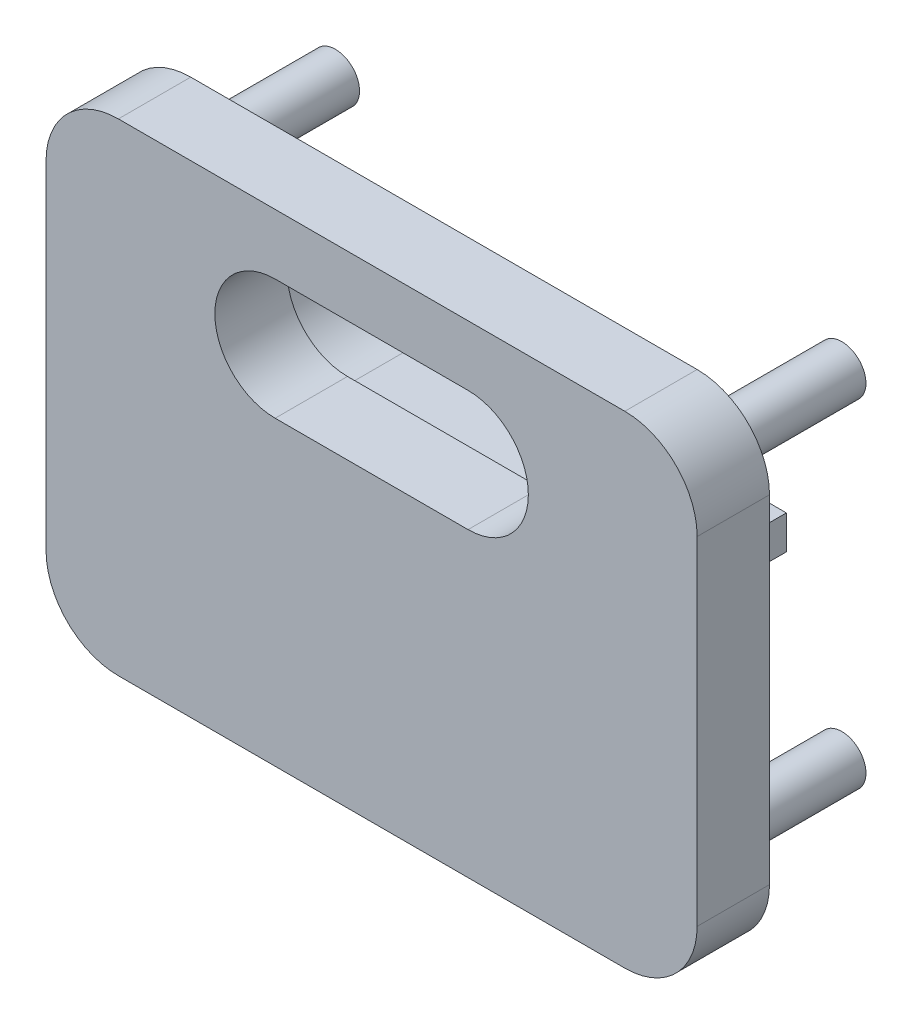
ISO-10303-21;
HEADER;
FILE_DESCRIPTION(('STEP AP214'),'2;1');
FILE_NAME('part.step','',(''),(''),'','','');
FILE_SCHEMA(('AUTOMOTIVE_DESIGN { 1 0 10303 214 1 1 1 1 }'));
ENDSEC;
DATA;
#1=APPLICATION_CONTEXT('core data for automotive mechanical design processes');
#2=APPLICATION_PROTOCOL_DEFINITION('international standard','automotive_design',2000,#1);
#3=PRODUCT_CONTEXT('',#1,'mechanical');
#4=PRODUCT('Part','Part','',(#3));
#5=PRODUCT_RELATED_PRODUCT_CATEGORY('part','',(#4));
#6=PRODUCT_DEFINITION_FORMATION('','',#4);
#7=PRODUCT_DEFINITION_CONTEXT('part definition',#1,'design');
#8=PRODUCT_DEFINITION('design','',#6,#7);
#9=PRODUCT_DEFINITION_SHAPE('','',#8);
#10=(LENGTH_UNIT() NAMED_UNIT(*) SI_UNIT(.MILLI.,.METRE.));
#11=(NAMED_UNIT(*) PLANE_ANGLE_UNIT() SI_UNIT($,.RADIAN.));
#12=(NAMED_UNIT(*) SI_UNIT($,.STERADIAN.) SOLID_ANGLE_UNIT());
#13=UNCERTAINTY_MEASURE_WITH_UNIT(LENGTH_MEASURE(1.E-05),#10,'distance_accuracy_value','');
#14=(GEOMETRIC_REPRESENTATION_CONTEXT(3) GLOBAL_UNCERTAINTY_ASSIGNED_CONTEXT((#13)) GLOBAL_UNIT_ASSIGNED_CONTEXT((#10,
#11,#12)) REPRESENTATION_CONTEXT('',''));
#15=CARTESIAN_POINT('',(0.,0.,0.));
#16=DIRECTION('',(0.,0.,1.));
#17=DIRECTION('',(1.,0.,0.));
#18=AXIS2_PLACEMENT_3D('',#15,#16,#17);
#19=CARTESIAN_POINT('',(0.,0.,-50.));
#20=DIRECTION('',(0.,-1.,0.));
#21=DIRECTION('',(0.,0.,-1.));
#22=AXIS2_PLACEMENT_3D('',#19,#20,#21);
#23=PLANE('',#22);
#24=DIRECTION('',(1.,0.,0.));
#25=VECTOR('',#24,1.);
#26=CARTESIAN_POINT('',(-0.001000000000001,0.,-3.));
#27=LINE('',#26,#25);
#28=CARTESIAN_POINT('',(3.,0.,-3.));
#29=VERTEX_POINT('',#28);
#30=CARTESIAN_POINT('',(24.,0.,-3.));
#31=VERTEX_POINT('',#30);
#32=EDGE_CURVE('E342',#29,#31,#27,.T.);
#33=ORIENTED_EDGE('',*,*,#32,.T.);
#34=DIRECTION('',(0.,0.,1.));
#35=VECTOR('',#34,1.);
#36=CARTESIAN_POINT('',(24.,0.,-50.));
#37=LINE('',#36,#35);
#38=CARTESIAN_POINT('',(24.,0.,0.));
#39=VERTEX_POINT('',#38);
#40=EDGE_CURVE('E376',#31,#39,#37,.T.);
#41=ORIENTED_EDGE('',*,*,#40,.T.);
#42=DIRECTION('',(1.,0.,0.));
#43=VECTOR('',#42,1.);
#44=CARTESIAN_POINT('',(0.,0.,0.));
#45=LINE('',#44,#43);
#46=CARTESIAN_POINT('',(3.,0.,0.));
#47=VERTEX_POINT('',#46);
#48=EDGE_CURVE('E356',#47,#39,#45,.T.);
#49=ORIENTED_EDGE('',*,*,#48,.F.);
#50=DIRECTION('',(0.,0.,1.));
#51=VECTOR('',#50,1.);
#52=CARTESIAN_POINT('',(3.,0.,-50.));
#53=LINE('',#52,#51);
#54=EDGE_CURVE('E372',#47,#29,#53,.F.);
#55=ORIENTED_EDGE('',*,*,#54,.T.);
#56=EDGE_LOOP('',(#33,#41,#49,#55));
#57=FACE_BOUND('',#56,.T.);
#58=ADVANCED_FACE('F47',(#57),#23,.T.);
#59=CARTESIAN_POINT('',(0.,20.,-50.));
#60=DIRECTION('',(-1.,0.,0.));
#61=DIRECTION('',(0.,0.,1.));
#62=AXIS2_PLACEMENT_3D('',#59,#60,#61);
#63=PLANE('',#62);
#64=DIRECTION('',(0.,-1.,0.));
#65=VECTOR('',#64,1.);
#66=CARTESIAN_POINT('',(0.,0.,-3.));
#67=LINE('',#66,#65);
#68=CARTESIAN_POINT('',(0.,17.,-3.));
#69=VERTEX_POINT('',#68);
#70=CARTESIAN_POINT('',(0.,3.,-3.));
#71=VERTEX_POINT('',#70);
#72=EDGE_CURVE('E346',#69,#71,#67,.T.);
#73=ORIENTED_EDGE('',*,*,#72,.T.);
#74=DIRECTION('',(0.,0.,1.));
#75=VECTOR('',#74,1.);
#76=CARTESIAN_POINT('',(0.,3.,-50.));
#77=LINE('',#76,#75);
#78=CARTESIAN_POINT('',(0.,3.,0.));
#79=VERTEX_POINT('',#78);
#80=EDGE_CURVE('E409',#71,#79,#77,.T.);
#81=ORIENTED_EDGE('',*,*,#80,.T.);
#82=DIRECTION('',(0.,-1.,0.));
#83=VECTOR('',#82,1.);
#84=CARTESIAN_POINT('',(0.,20.,0.));
#85=LINE('',#84,#83);
#86=CARTESIAN_POINT('',(0.,17.,0.));
#87=VERTEX_POINT('',#86);
#88=EDGE_CURVE('E368',#87,#79,#85,.T.);
#89=ORIENTED_EDGE('',*,*,#88,.F.);
#90=DIRECTION('',(0.,0.,1.));
#91=VECTOR('',#90,1.);
#92=CARTESIAN_POINT('',(0.,17.,-50.));
#93=LINE('',#92,#91);
#94=EDGE_CURVE('E405',#87,#69,#93,.F.);
#95=ORIENTED_EDGE('',*,*,#94,.T.);
#96=EDGE_LOOP('',(#73,#81,#89,#95));
#97=FACE_BOUND('',#96,.T.);
#98=ADVANCED_FACE('F449',(#97),#63,.T.);
#99=CARTESIAN_POINT('',(0.,20.,-50.));
#100=DIRECTION('',(0.,1.,0.));
#101=DIRECTION('',(0.,0.,1.));
#102=AXIS2_PLACEMENT_3D('',#99,#100,#101);
#103=PLANE('',#102);
#104=DIRECTION('',(1.,0.,0.));
#105=VECTOR('',#104,1.);
#106=CARTESIAN_POINT('',(-0.00100000000001488,20.,-3.));
#107=LINE('',#106,#105);
#108=CARTESIAN_POINT('',(3.,20.,-3.));
#109=VERTEX_POINT('',#108);
#110=CARTESIAN_POINT('',(24.,20.,-3.));
#111=VERTEX_POINT('',#110);
#112=EDGE_CURVE('E341',#109,#111,#107,.T.);
#113=ORIENTED_EDGE('',*,*,#112,.F.);
#114=DIRECTION('',(0.,0.,1.));
#115=VECTOR('',#114,1.);
#116=CARTESIAN_POINT('',(3.,20.,-50.));
#117=LINE('',#116,#115);
#118=CARTESIAN_POINT('',(3.,20.,0.));
#119=VERTEX_POINT('',#118);
#120=EDGE_CURVE('E398',#109,#119,#117,.T.);
#121=ORIENTED_EDGE('',*,*,#120,.T.);
#122=DIRECTION('',(-1.,0.,0.));
#123=VECTOR('',#122,1.);
#124=CARTESIAN_POINT('',(0.,20.,0.));
#125=LINE('',#124,#123);
#126=CARTESIAN_POINT('',(24.,20.,0.));
#127=VERTEX_POINT('',#126);
#128=EDGE_CURVE('E364',#127,#119,#125,.T.);
#129=ORIENTED_EDGE('',*,*,#128,.F.);
#130=DIRECTION('',(0.,0.,1.));
#131=VECTOR('',#130,1.);
#132=CARTESIAN_POINT('',(24.,20.,-50.));
#133=LINE('',#132,#131);
#134=EDGE_CURVE('E401',#127,#111,#133,.F.);
#135=ORIENTED_EDGE('',*,*,#134,.T.);
#136=EDGE_LOOP('',(#113,#121,#129,#135));
#137=FACE_BOUND('',#136,.T.);
#138=ADVANCED_FACE('F454',(#137),#103,.T.);
#139=CARTESIAN_POINT('',(27.,20.,-50.));
#140=DIRECTION('',(1.,0.,0.));
#141=DIRECTION('',(0.,1.,0.));
#142=AXIS2_PLACEMENT_3D('',#139,#140,#141);
#143=PLANE('',#142);
#144=DIRECTION('',(0.,-1.,0.));
#145=VECTOR('',#144,1.);
#146=CARTESIAN_POINT('',(27.,0.,-3.));
#147=LINE('',#146,#145);
#148=CARTESIAN_POINT('',(27.,17.,-3.));
#149=VERTEX_POINT('',#148);
#150=CARTESIAN_POINT('',(27.,3.,-3.));
#151=VERTEX_POINT('',#150);
#152=EDGE_CURVE('E338',#149,#151,#147,.T.);
#153=ORIENTED_EDGE('',*,*,#152,.F.);
#154=DIRECTION('',(0.,0.,1.));
#155=VECTOR('',#154,1.);
#156=CARTESIAN_POINT('',(27.,17.,-50.));
#157=LINE('',#156,#155);
#158=CARTESIAN_POINT('',(27.,17.,0.));
#159=VERTEX_POINT('',#158);
#160=EDGE_CURVE('E391',#149,#159,#157,.T.);
#161=ORIENTED_EDGE('',*,*,#160,.T.);
#162=DIRECTION('',(0.,1.,0.));
#163=VECTOR('',#162,1.);
#164=CARTESIAN_POINT('',(27.,20.,0.));
#165=LINE('',#164,#163);
#166=CARTESIAN_POINT('',(27.,3.,0.));
#167=VERTEX_POINT('',#166);
#168=EDGE_CURVE('E360',#167,#159,#165,.T.);
#169=ORIENTED_EDGE('',*,*,#168,.F.);
#170=DIRECTION('',(0.,0.,1.));
#171=VECTOR('',#170,1.);
#172=CARTESIAN_POINT('',(27.,3.,-50.));
#173=LINE('',#172,#171);
#174=EDGE_CURVE('E394',#167,#151,#173,.F.);
#175=ORIENTED_EDGE('',*,*,#174,.T.);
#176=EDGE_LOOP('',(#153,#161,#169,#175));
#177=FACE_BOUND('',#176,.T.);
#178=ADVANCED_FACE('F463',(#177),#143,.T.);
#179=CARTESIAN_POINT('',(0.,0.,0.));
#180=DIRECTION('',(0.,0.,-1.));
#181=DIRECTION('',(-1.,0.,0.));
#182=AXIS2_PLACEMENT_3D('',#179,#180,#181);
#183=PLANE('',#182);
#184=DIRECTION('',(-1.,0.,0.));
#185=VECTOR('',#184,1.);
#186=CARTESIAN_POINT('',(17.5,17.5,0.));
#187=LINE('',#186,#185);
#188=CARTESIAN_POINT('',(17.5,17.5,0.));
#189=VERTEX_POINT('',#188);
#190=CARTESIAN_POINT('',(9.49999999999999,17.5,0.));
#191=VERTEX_POINT('',#190);
#192=EDGE_CURVE('E291',#189,#191,#187,.T.);
#193=ORIENTED_EDGE('',*,*,#192,.F.);
#194=CARTESIAN_POINT('',(17.5,15.,0.));
#195=DIRECTION('',(0.,0.,-1.));
#196=DIRECTION('',(-1.,0.,0.));
#197=AXIS2_PLACEMENT_3D('',#194,#195,#196);
#198=CIRCLE('',#197,2.5);
#199=CARTESIAN_POINT('',(17.5,12.5,0.));
#200=VERTEX_POINT('',#199);
#201=EDGE_CURVE('E295',#200,#189,#198,.F.);
#202=ORIENTED_EDGE('',*,*,#201,.F.);
#203=DIRECTION('',(1.,0.,0.));
#204=VECTOR('',#203,1.);
#205=CARTESIAN_POINT('',(17.5,12.5,0.));
#206=LINE('',#205,#204);
#207=CARTESIAN_POINT('',(9.49999999999999,12.5,0.));
#208=VERTEX_POINT('',#207);
#209=EDGE_CURVE('E310',#208,#200,#206,.T.);
#210=ORIENTED_EDGE('',*,*,#209,.F.);
#211=CARTESIAN_POINT('',(9.49999999999999,15.,0.));
#212=DIRECTION('',(0.,0.,-1.));
#213=DIRECTION('',(-1.,0.,0.));
#214=AXIS2_PLACEMENT_3D('',#211,#212,#213);
#215=CIRCLE('',#214,2.5);
#216=EDGE_CURVE('E288',#191,#208,#215,.F.);
#217=ORIENTED_EDGE('',*,*,#216,.F.);
#218=EDGE_LOOP('',(#193,#202,#210,#217));
#219=FACE_BOUND('',#218,.T.);
#220=ORIENTED_EDGE('',*,*,#48,.T.);
#221=CARTESIAN_POINT('',(24.,3.,0.));
#222=DIRECTION('',(0.,0.,-1.));
#223=DIRECTION('',(-1.,0.,0.));
#224=AXIS2_PLACEMENT_3D('',#221,#222,#223);
#225=CIRCLE('',#224,3.);
#226=EDGE_CURVE('E388',#39,#167,#225,.F.);
#227=ORIENTED_EDGE('',*,*,#226,.T.);
#228=ORIENTED_EDGE('',*,*,#168,.T.);
#229=CARTESIAN_POINT('',(24.,17.,0.));
#230=DIRECTION('',(0.,0.,-1.));
#231=DIRECTION('',(-1.,0.,0.));
#232=AXIS2_PLACEMENT_3D('',#229,#230,#231);
#233=CIRCLE('',#232,3.);
#234=EDGE_CURVE('E385',#159,#127,#233,.F.);
#235=ORIENTED_EDGE('',*,*,#234,.T.);
#236=ORIENTED_EDGE('',*,*,#128,.T.);
#237=CARTESIAN_POINT('',(3.,17.,0.));
#238=DIRECTION('',(0.,0.,-1.));
#239=DIRECTION('',(-1.,0.,0.));
#240=AXIS2_PLACEMENT_3D('',#237,#238,#239);
#241=CIRCLE('',#240,3.);
#242=EDGE_CURVE('E379',#119,#87,#241,.F.);
#243=ORIENTED_EDGE('',*,*,#242,.T.);
#244=ORIENTED_EDGE('',*,*,#88,.T.);
#245=CARTESIAN_POINT('',(3.,3.,0.));
#246=DIRECTION('',(0.,0.,-1.));
#247=DIRECTION('',(-1.,0.,0.));
#248=AXIS2_PLACEMENT_3D('',#245,#246,#247);
#249=CIRCLE('',#248,3.);
#250=EDGE_CURVE('E382',#79,#47,#249,.F.);
#251=ORIENTED_EDGE('',*,*,#250,.T.);
#252=EDGE_LOOP('',(#220,#227,#228,#235,#236,#243,#244,#251));
#253=FACE_BOUND('',#252,.T.);
#254=ADVANCED_FACE('F443',(#219,#253),#183,.F.);
#255=CARTESIAN_POINT('',(24.,3.,-50.));
#256=DIRECTION('',(0.,0.,1.));
#257=DIRECTION('',(1.,0.,0.));
#258=AXIS2_PLACEMENT_3D('',#255,#256,#257);
#259=CYLINDRICAL_SURFACE('',#258,3.);
#260=CARTESIAN_POINT('',(24.,3.,-3.));
#261=DIRECTION('',(0.,0.,1.));
#262=DIRECTION('',(0.,-1.,0.));
#263=AXIS2_PLACEMENT_3D('',#260,#261,#262);
#264=CIRCLE('',#263,3.);
#265=EDGE_CURVE('E330',#31,#151,#264,.T.);
#266=ORIENTED_EDGE('',*,*,#265,.T.);
#267=ORIENTED_EDGE('',*,*,#174,.F.);
#268=ORIENTED_EDGE('',*,*,#226,.F.);
#269=ORIENTED_EDGE('',*,*,#40,.F.);
#270=EDGE_LOOP('',(#266,#267,#268,#269));
#271=FACE_BOUND('',#270,.T.);
#272=ADVANCED_FACE('F466',(#271),#259,.T.);
#273=CARTESIAN_POINT('',(24.,17.,-50.));
#274=DIRECTION('',(0.,0.,1.));
#275=DIRECTION('',(1.,0.,0.));
#276=AXIS2_PLACEMENT_3D('',#273,#274,#275);
#277=CYLINDRICAL_SURFACE('',#276,3.);
#278=CARTESIAN_POINT('',(24.,17.,-3.));
#279=DIRECTION('',(0.,0.,1.));
#280=DIRECTION('',(0.,-1.,0.));
#281=AXIS2_PLACEMENT_3D('',#278,#279,#280);
#282=CIRCLE('',#281,3.);
#283=EDGE_CURVE('E326',#149,#111,#282,.T.);
#284=ORIENTED_EDGE('',*,*,#283,.T.);
#285=ORIENTED_EDGE('',*,*,#134,.F.);
#286=ORIENTED_EDGE('',*,*,#234,.F.);
#287=ORIENTED_EDGE('',*,*,#160,.F.);
#288=EDGE_LOOP('',(#284,#285,#286,#287));
#289=FACE_BOUND('',#288,.T.);
#290=ADVANCED_FACE('F459',(#289),#277,.T.);
#291=CARTESIAN_POINT('',(3.,3.,-50.));
#292=DIRECTION('',(0.,0.,1.));
#293=DIRECTION('',(1.,0.,0.));
#294=AXIS2_PLACEMENT_3D('',#291,#292,#293);
#295=CYLINDRICAL_SURFACE('',#294,3.);
#296=CARTESIAN_POINT('',(3.,3.,-3.));
#297=DIRECTION('',(0.,0.,1.));
#298=DIRECTION('',(0.,-1.,0.));
#299=AXIS2_PLACEMENT_3D('',#296,#297,#298);
#300=CIRCLE('',#299,3.);
#301=EDGE_CURVE('E352',#71,#29,#300,.T.);
#302=ORIENTED_EDGE('',*,*,#301,.T.);
#303=ORIENTED_EDGE('',*,*,#54,.F.);
#304=ORIENTED_EDGE('',*,*,#250,.F.);
#305=ORIENTED_EDGE('',*,*,#80,.F.);
#306=EDGE_LOOP('',(#302,#303,#304,#305));
#307=FACE_BOUND('',#306,.T.);
#308=ADVANCED_FACE('F438',(#307),#295,.T.);
#309=CARTESIAN_POINT('',(3.,17.,-50.));
#310=DIRECTION('',(0.,0.,1.));
#311=DIRECTION('',(1.,0.,0.));
#312=AXIS2_PLACEMENT_3D('',#309,#310,#311);
#313=CYLINDRICAL_SURFACE('',#312,3.);
#314=CARTESIAN_POINT('',(3.,17.,-3.));
#315=DIRECTION('',(0.,0.,1.));
#316=DIRECTION('',(0.,-1.,0.));
#317=AXIS2_PLACEMENT_3D('',#314,#315,#316);
#318=CIRCLE('',#317,3.);
#319=EDGE_CURVE('E334',#109,#69,#318,.T.);
#320=ORIENTED_EDGE('',*,*,#319,.T.);
#321=ORIENTED_EDGE('',*,*,#94,.F.);
#322=ORIENTED_EDGE('',*,*,#242,.F.);
#323=ORIENTED_EDGE('',*,*,#120,.F.);
#324=EDGE_LOOP('',(#320,#321,#322,#323));
#325=FACE_BOUND('',#324,.T.);
#326=ADVANCED_FACE('F49',(#325),#313,.T.);
#327=CARTESIAN_POINT('',(-0.001000000000001,0.,-3.));
#328=DIRECTION('',(0.,0.,1.));
#329=DIRECTION('',(0.,-1.,0.));
#330=AXIS2_PLACEMENT_3D('',#327,#328,#329);
#331=PLANE('',#330);
#332=DIRECTION('',(1.,0.,0.));
#333=VECTOR('',#332,1.);
#334=CARTESIAN_POINT('',(0.,12.5,-3.));
#335=LINE('',#334,#333);
#336=CARTESIAN_POINT('',(9.49999999999999,12.5,-3.));
#337=VERTEX_POINT('',#336);
#338=CARTESIAN_POINT('',(17.5,12.5,-3.));
#339=VERTEX_POINT('',#338);
#340=EDGE_CURVE('E257',#337,#339,#335,.T.);
#341=ORIENTED_EDGE('',*,*,#340,.T.);
#342=CARTESIAN_POINT('',(17.5,15.,-3.));
#343=DIRECTION('',(0.,0.,1.));
#344=DIRECTION('',(0.,-1.,0.));
#345=AXIS2_PLACEMENT_3D('',#342,#343,#344);
#346=CIRCLE('',#345,2.5);
#347=CARTESIAN_POINT('',(17.5,17.5,-3.));
#348=VERTEX_POINT('',#347);
#349=EDGE_CURVE('E303',#348,#339,#346,.F.);
#350=ORIENTED_EDGE('',*,*,#349,.F.);
#351=DIRECTION('',(1.,0.,0.));
#352=VECTOR('',#351,1.);
#353=CARTESIAN_POINT('',(17.5,17.5,-3.));
#354=LINE('',#353,#352);
#355=CARTESIAN_POINT('',(9.49999999999999,17.5,-3.));
#356=VERTEX_POINT('',#355);
#357=EDGE_CURVE('E299',#356,#348,#354,.T.);
#358=ORIENTED_EDGE('',*,*,#357,.F.);
#359=CARTESIAN_POINT('',(9.49999999999999,15.,-3.));
#360=DIRECTION('',(0.,0.,1.));
#361=DIRECTION('',(0.,-1.,0.));
#362=AXIS2_PLACEMENT_3D('',#359,#360,#361);
#363=CIRCLE('',#362,2.5);
#364=EDGE_CURVE('E71',#337,#356,#363,.F.);
#365=ORIENTED_EDGE('',*,*,#364,.F.);
#366=EDGE_LOOP('',(#341,#350,#358,#365));
#367=FACE_BOUND('',#366,.T.);
#368=CARTESIAN_POINT('',(24.,3.,-3.));
#369=DIRECTION('',(0.,0.,1.));
#370=DIRECTION('',(0.,-1.,0.));
#371=AXIS2_PLACEMENT_3D('',#368,#369,#370);
#372=CIRCLE('',#371,1.);
#373=CARTESIAN_POINT('',(24.,2.,-3.));
#374=VERTEX_POINT('',#373);
#375=EDGE_CURVE('E11',#374,#374,#372,.F.);
#376=ORIENTED_EDGE('',*,*,#375,.F.);
#377=EDGE_LOOP('',(#376));
#378=FACE_BOUND('',#377,.T.);
#379=CARTESIAN_POINT('',(3.,3.,-3.));
#380=DIRECTION('',(0.,0.,1.));
#381=DIRECTION('',(0.,-1.,0.));
#382=AXIS2_PLACEMENT_3D('',#379,#380,#381);
#383=CIRCLE('',#382,1.);
#384=CARTESIAN_POINT('',(3.,2.,-3.));
#385=VERTEX_POINT('',#384);
#386=EDGE_CURVE('E56',#385,#385,#383,.F.);
#387=ORIENTED_EDGE('',*,*,#386,.F.);
#388=EDGE_LOOP('',(#387));
#389=FACE_BOUND('',#388,.T.);
#390=CARTESIAN_POINT('',(3.,17.,-3.));
#391=DIRECTION('',(0.,0.,1.));
#392=DIRECTION('',(0.,-1.,0.));
#393=AXIS2_PLACEMENT_3D('',#390,#391,#392);
#394=CIRCLE('',#393,1.);
#395=CARTESIAN_POINT('',(3.,16.,-3.));
#396=VERTEX_POINT('',#395);
#397=EDGE_CURVE('E416',#396,#396,#394,.F.);
#398=ORIENTED_EDGE('',*,*,#397,.F.);
#399=EDGE_LOOP('',(#398));
#400=FACE_BOUND('',#399,.T.);
#401=CARTESIAN_POINT('',(24.,17.,-3.));
#402=DIRECTION('',(0.,0.,1.));
#403=DIRECTION('',(0.,-1.,0.));
#404=AXIS2_PLACEMENT_3D('',#401,#402,#403);
#405=CIRCLE('',#404,1.);
#406=CARTESIAN_POINT('',(24.,16.,-3.));
#407=VERTEX_POINT('',#406);
#408=EDGE_CURVE('E412',#407,#407,#405,.F.);
#409=ORIENTED_EDGE('',*,*,#408,.F.);
#410=EDGE_LOOP('',(#409));
#411=FACE_BOUND('',#410,.T.);
#412=ORIENTED_EDGE('',*,*,#32,.F.);
#413=ORIENTED_EDGE('',*,*,#301,.F.);
#414=ORIENTED_EDGE('',*,*,#72,.F.);
#415=ORIENTED_EDGE('',*,*,#319,.F.);
#416=ORIENTED_EDGE('',*,*,#112,.T.);
#417=ORIENTED_EDGE('',*,*,#283,.F.);
#418=ORIENTED_EDGE('',*,*,#152,.T.);
#419=ORIENTED_EDGE('',*,*,#265,.F.);
#420=EDGE_LOOP('',(#412,#413,#414,#415,#416,#417,#418,#419));
#421=FACE_BOUND('',#420,.T.);
#422=CARTESIAN_POINT('',(17.5,15.,-3.));
#423=DIRECTION('',(0.,0.,1.));
#424=DIRECTION('',(0.,-1.,0.));
#425=AXIS2_PLACEMENT_3D('',#422,#423,#424);
#426=CIRCLE('',#425,2.8);
#427=CARTESIAN_POINT('',(20.0298221281347,16.2,-3.));
#428=VERTEX_POINT('',#427);
#429=CARTESIAN_POINT('',(17.5,12.2,-3.));
#430=VERTEX_POINT('',#429);
#431=EDGE_CURVE('E236',#428,#430,#426,.F.);
#432=ORIENTED_EDGE('',*,*,#431,.T.);
#433=DIRECTION('',(-1.,0.,0.));
#434=VECTOR('',#433,1.);
#435=CARTESIAN_POINT('',(0.,12.2,-3.));
#436=LINE('',#435,#434);
#437=CARTESIAN_POINT('',(9.49999999999999,12.2,-3.));
#438=VERTEX_POINT('',#437);
#439=EDGE_CURVE('E721',#430,#438,#436,.T.);
#440=ORIENTED_EDGE('',*,*,#439,.T.);
#441=CARTESIAN_POINT('',(9.49999999999999,15.,-3.));
#442=DIRECTION('',(0.,0.,1.));
#443=DIRECTION('',(0.,-1.,0.));
#444=AXIS2_PLACEMENT_3D('',#441,#442,#443);
#445=CIRCLE('',#444,2.8);
#446=CARTESIAN_POINT('',(6.9701778718653,16.2,-3.));
#447=VERTEX_POINT('',#446);
#448=EDGE_CURVE('E713',#438,#447,#445,.F.);
#449=ORIENTED_EDGE('',*,*,#448,.T.);
#450=DIRECTION('',(1.,0.,0.));
#451=VECTOR('',#450,1.);
#452=CARTESIAN_POINT('',(0.,16.2,-3.));
#453=LINE('',#452,#451);
#454=CARTESIAN_POINT('',(4.3,16.2,-3.));
#455=VERTEX_POINT('',#454);
#456=EDGE_CURVE('E719',#455,#447,#453,.T.);
#457=ORIENTED_EDGE('',*,*,#456,.F.);
#458=DIRECTION('',(0.,1.,0.));
#459=VECTOR('',#458,1.);
#460=CARTESIAN_POINT('',(4.3,0.,-3.));
#461=LINE('',#460,#459);
#462=CARTESIAN_POINT('',(4.3,13.7,-3.));
#463=VERTEX_POINT('',#462);
#464=EDGE_CURVE('E726',#463,#455,#461,.T.);
#465=ORIENTED_EDGE('',*,*,#464,.F.);
#466=DIRECTION('',(1.,0.,0.));
#467=VECTOR('',#466,1.);
#468=CARTESIAN_POINT('',(0.,13.7,-3.));
#469=LINE('',#468,#467);
#470=CARTESIAN_POINT('',(2.29999999999999,13.7,-3.));
#471=VERTEX_POINT('',#470);
#472=EDGE_CURVE('E732',#471,#463,#469,.T.);
#473=ORIENTED_EDGE('',*,*,#472,.F.);
#474=DIRECTION('',(0.,1.,0.));
#475=VECTOR('',#474,1.);
#476=CARTESIAN_POINT('',(2.29999999999999,0.,-3.));
#477=LINE('',#476,#475);
#478=CARTESIAN_POINT('',(2.29999999999999,12.3,-3.));
#479=VERTEX_POINT('',#478);
#480=EDGE_CURVE('E735',#479,#471,#477,.T.);
#481=ORIENTED_EDGE('',*,*,#480,.F.);
#482=DIRECTION('',(-1.,0.,0.));
#483=VECTOR('',#482,1.);
#484=CARTESIAN_POINT('',(0.,12.3,-3.));
#485=LINE('',#484,#483);
#486=CARTESIAN_POINT('',(4.8,12.3,-3.));
#487=VERTEX_POINT('',#486);
#488=EDGE_CURVE('E738',#487,#479,#485,.T.);
#489=ORIENTED_EDGE('',*,*,#488,.F.);
#490=DIRECTION('',(0.,1.,0.));
#491=VECTOR('',#490,1.);
#492=CARTESIAN_POINT('',(4.8,0.,-3.));
#493=LINE('',#492,#491);
#494=CARTESIAN_POINT('',(4.8,3.3,-3.));
#495=VERTEX_POINT('',#494);
#496=EDGE_CURVE('E741',#495,#487,#493,.T.);
#497=ORIENTED_EDGE('',*,*,#496,.F.);
#498=DIRECTION('',(-1.,0.,0.));
#499=VECTOR('',#498,1.);
#500=CARTESIAN_POINT('',(0.,3.3,-3.));
#501=LINE('',#500,#499);
#502=CARTESIAN_POINT('',(22.2,3.3,-3.));
#503=VERTEX_POINT('',#502);
#504=EDGE_CURVE('E744',#503,#495,#501,.T.);
#505=ORIENTED_EDGE('',*,*,#504,.F.);
#506=DIRECTION('',(0.,-1.,0.));
#507=VECTOR('',#506,1.);
#508=CARTESIAN_POINT('',(22.2,0.,-3.));
#509=LINE('',#508,#507);
#510=CARTESIAN_POINT('',(22.2,12.3,-3.));
#511=VERTEX_POINT('',#510);
#512=EDGE_CURVE('E747',#511,#503,#509,.T.);
#513=ORIENTED_EDGE('',*,*,#512,.F.);
#514=DIRECTION('',(-1.,0.,0.));
#515=VECTOR('',#514,1.);
#516=CARTESIAN_POINT('',(0.,12.3,-3.));
#517=LINE('',#516,#515);
#518=CARTESIAN_POINT('',(24.7,12.3,-3.));
#519=VERTEX_POINT('',#518);
#520=EDGE_CURVE('E614',#519,#511,#517,.T.);
#521=ORIENTED_EDGE('',*,*,#520,.F.);
#522=DIRECTION('',(0.,-1.,0.));
#523=VECTOR('',#522,1.);
#524=CARTESIAN_POINT('',(24.7,0.,-3.));
#525=LINE('',#524,#523);
#526=CARTESIAN_POINT('',(24.7,13.7,-3.));
#527=VERTEX_POINT('',#526);
#528=EDGE_CURVE('E610',#527,#519,#525,.T.);
#529=ORIENTED_EDGE('',*,*,#528,.F.);
#530=DIRECTION('',(1.,0.,0.));
#531=VECTOR('',#530,1.);
#532=CARTESIAN_POINT('',(0.,13.7,-3.));
#533=LINE('',#532,#531);
#534=CARTESIAN_POINT('',(22.7,13.7,-3.));
#535=VERTEX_POINT('',#534);
#536=EDGE_CURVE('E601',#535,#527,#533,.T.);
#537=ORIENTED_EDGE('',*,*,#536,.F.);
#538=DIRECTION('',(0.,-1.,0.));
#539=VECTOR('',#538,1.);
#540=CARTESIAN_POINT('',(22.7,0.,-3.));
#541=LINE('',#540,#539);
#542=CARTESIAN_POINT('',(22.7,16.2,-3.));
#543=VERTEX_POINT('',#542);
#544=EDGE_CURVE('E254',#543,#535,#541,.T.);
#545=ORIENTED_EDGE('',*,*,#544,.F.);
#546=DIRECTION('',(1.,0.,0.));
#547=VECTOR('',#546,1.);
#548=CARTESIAN_POINT('',(0.,16.2,-3.));
#549=LINE('',#548,#547);
#550=EDGE_CURVE('E251',#428,#543,#549,.T.);
#551=ORIENTED_EDGE('',*,*,#550,.F.);
#552=EDGE_LOOP('',(#432,#440,#449,#457,#465,#473,#481,#489,#497,#505,#513,#521,#529,#537,#545,#551));
#553=FACE_BOUND('',#552,.T.);
#554=ADVANCED_FACE('F252',(#367,#378,#389,#400,#411,#421,#553),#331,.F.);
#555=CARTESIAN_POINT('',(17.5,15.,0.00100000000000013));
#556=DIRECTION('',(0.,0.,-1.));
#557=DIRECTION('',(-1.,0.,0.));
#558=AXIS2_PLACEMENT_3D('',#555,#556,#557);
#559=CYLINDRICAL_SURFACE('',#558,2.5);
#560=ORIENTED_EDGE('',*,*,#349,.T.);
#561=DIRECTION('',(0.,0.,-1.));
#562=VECTOR('',#561,1.);
#563=CARTESIAN_POINT('',(17.5,12.5,0.00100000000000013));
#564=LINE('',#563,#562);
#565=EDGE_CURVE('E306',#200,#339,#564,.T.);
#566=ORIENTED_EDGE('',*,*,#565,.F.);
#567=ORIENTED_EDGE('',*,*,#201,.T.);
#568=DIRECTION('',(0.,0.,-1.));
#569=VECTOR('',#568,1.);
#570=CARTESIAN_POINT('',(17.5,17.5,0.00100000000000013));
#571=LINE('',#570,#569);
#572=EDGE_CURVE('E307',#189,#348,#571,.T.);
#573=ORIENTED_EDGE('',*,*,#572,.T.);
#574=EDGE_LOOP('',(#560,#566,#567,#573));
#575=FACE_BOUND('',#574,.T.);
#576=ADVANCED_FACE('F427',(#575),#559,.F.);
#577=CARTESIAN_POINT('',(17.5,17.5,0.00100000000000013));
#578=DIRECTION('',(0.,1.,0.));
#579=DIRECTION('',(0.,0.,1.));
#580=AXIS2_PLACEMENT_3D('',#577,#578,#579);
#581=PLANE('',#580);
#582=ORIENTED_EDGE('',*,*,#192,.T.);
#583=DIRECTION('',(0.,0.,-1.));
#584=VECTOR('',#583,1.);
#585=CARTESIAN_POINT('',(9.49999999999999,17.5,0.00100000000000013));
#586=LINE('',#585,#584);
#587=EDGE_CURVE('E311',#191,#356,#586,.T.);
#588=ORIENTED_EDGE('',*,*,#587,.T.);
#589=ORIENTED_EDGE('',*,*,#357,.T.);
#590=ORIENTED_EDGE('',*,*,#572,.F.);
#591=EDGE_LOOP('',(#582,#588,#589,#590));
#592=FACE_BOUND('',#591,.T.);
#593=ADVANCED_FACE('F493',(#592),#581,.F.);
#594=CARTESIAN_POINT('',(9.49999999999999,15.,0.00100000000000013));
#595=DIRECTION('',(0.,0.,-1.));
#596=DIRECTION('',(-1.,0.,0.));
#597=AXIS2_PLACEMENT_3D('',#594,#595,#596);
#598=CYLINDRICAL_SURFACE('',#597,2.5);
#599=DIRECTION('',(0.,0.,-1.));
#600=VECTOR('',#599,1.);
#601=CARTESIAN_POINT('',(9.49999999999999,12.5,0.00100000000000013));
#602=LINE('',#601,#600);
#603=EDGE_CURVE('E314',#208,#337,#602,.T.);
#604=ORIENTED_EDGE('',*,*,#603,.T.);
#605=ORIENTED_EDGE('',*,*,#364,.T.);
#606=ORIENTED_EDGE('',*,*,#587,.F.);
#607=ORIENTED_EDGE('',*,*,#216,.T.);
#608=EDGE_LOOP('',(#604,#605,#606,#607));
#609=FACE_BOUND('',#608,.T.);
#610=ADVANCED_FACE('F499',(#609),#598,.F.);
#611=CARTESIAN_POINT('',(17.5,12.5,0.00100000000000013));
#612=DIRECTION('',(0.,-1.,0.));
#613=DIRECTION('',(0.,0.,-1.));
#614=AXIS2_PLACEMENT_3D('',#611,#612,#613);
#615=PLANE('',#614);
#616=ORIENTED_EDGE('',*,*,#565,.T.);
#617=ORIENTED_EDGE('',*,*,#340,.F.);
#618=ORIENTED_EDGE('',*,*,#603,.F.);
#619=ORIENTED_EDGE('',*,*,#209,.T.);
#620=EDGE_LOOP('',(#616,#617,#618,#619));
#621=FACE_BOUND('',#620,.T.);
#622=ADVANCED_FACE('F495',(#621),#615,.F.);
#623=CARTESIAN_POINT('',(24.,17.,-9.));
#624=DIRECTION('',(0.,0.,1.));
#625=DIRECTION('',(0.,-1.,0.));
#626=AXIS2_PLACEMENT_3D('',#623,#624,#625);
#627=CYLINDRICAL_SURFACE('',#626,1.);
#628=CARTESIAN_POINT('',(24.,17.,-9.));
#629=DIRECTION('',(0.,0.,-1.));
#630=DIRECTION('',(0.,1.,0.));
#631=AXIS2_PLACEMENT_3D('',#628,#629,#630);
#632=CIRCLE('',#631,1.);
#633=CARTESIAN_POINT('',(24.,18.,-9.));
#634=VERTEX_POINT('',#633);
#635=EDGE_CURVE('E277',#634,#634,#632,.T.);
#636=ORIENTED_EDGE('',*,*,#635,.F.);
#637=EDGE_LOOP('',(#636));
#638=FACE_BOUND('',#637,.T.);
#639=ORIENTED_EDGE('',*,*,#408,.T.);
#640=EDGE_LOOP('',(#639));
#641=FACE_BOUND('',#640,.T.);
#642=ADVANCED_FACE('F498',(#638,#641),#627,.T.);
#643=CARTESIAN_POINT('',(24.,17.,-9.));
#644=DIRECTION('',(0.,0.,-1.));
#645=DIRECTION('',(0.,1.,0.));
#646=AXIS2_PLACEMENT_3D('',#643,#644,#645);
#647=PLANE('',#646);
#648=ORIENTED_EDGE('',*,*,#635,.T.);
#649=EDGE_LOOP('',(#648));
#650=FACE_BOUND('',#649,.T.);
#651=ADVANCED_FACE('F509',(#650),#647,.T.);
#652=CARTESIAN_POINT('',(3.,17.,-9.));
#653=DIRECTION('',(0.,0.,1.));
#654=DIRECTION('',(0.,-1.,0.));
#655=AXIS2_PLACEMENT_3D('',#652,#653,#654);
#656=CYLINDRICAL_SURFACE('',#655,1.);
#657=CARTESIAN_POINT('',(3.,17.,-9.));
#658=DIRECTION('',(0.,0.,-1.));
#659=DIRECTION('',(0.,1.,0.));
#660=AXIS2_PLACEMENT_3D('',#657,#658,#659);
#661=CIRCLE('',#660,1.);
#662=CARTESIAN_POINT('',(3.,18.,-9.));
#663=VERTEX_POINT('',#662);
#664=EDGE_CURVE('E273',#663,#663,#661,.T.);
#665=ORIENTED_EDGE('',*,*,#664,.F.);
#666=EDGE_LOOP('',(#665));
#667=FACE_BOUND('',#666,.T.);
#668=ORIENTED_EDGE('',*,*,#397,.T.);
#669=EDGE_LOOP('',(#668));
#670=FACE_BOUND('',#669,.T.);
#671=ADVANCED_FACE('F513',(#667,#670),#656,.T.);
#672=CARTESIAN_POINT('',(3.,17.,-9.));
#673=DIRECTION('',(0.,0.,-1.));
#674=DIRECTION('',(0.,1.,0.));
#675=AXIS2_PLACEMENT_3D('',#672,#673,#674);
#676=PLANE('',#675);
#677=ORIENTED_EDGE('',*,*,#664,.T.);
#678=EDGE_LOOP('',(#677));
#679=FACE_BOUND('',#678,.T.);
#680=ADVANCED_FACE('F529',(#679),#676,.T.);
#681=CARTESIAN_POINT('',(3.,3.,-9.));
#682=DIRECTION('',(0.,0.,1.));
#683=DIRECTION('',(0.,-1.,0.));
#684=AXIS2_PLACEMENT_3D('',#681,#682,#683);
#685=CYLINDRICAL_SURFACE('',#684,1.);
#686=CARTESIAN_POINT('',(3.,3.,-9.));
#687=DIRECTION('',(0.,0.,-1.));
#688=DIRECTION('',(0.,1.,0.));
#689=AXIS2_PLACEMENT_3D('',#686,#687,#688);
#690=CIRCLE('',#689,1.);
#691=CARTESIAN_POINT('',(3.,4.,-9.));
#692=VERTEX_POINT('',#691);
#693=EDGE_CURVE('E278',#692,#692,#690,.T.);
#694=ORIENTED_EDGE('',*,*,#693,.F.);
#695=EDGE_LOOP('',(#694));
#696=FACE_BOUND('',#695,.T.);
#697=ORIENTED_EDGE('',*,*,#386,.T.);
#698=EDGE_LOOP('',(#697));
#699=FACE_BOUND('',#698,.T.);
#700=ADVANCED_FACE('F423',(#696,#699),#685,.T.);
#701=CARTESIAN_POINT('',(3.,3.,-9.));
#702=DIRECTION('',(0.,0.,-1.));
#703=DIRECTION('',(0.,1.,0.));
#704=AXIS2_PLACEMENT_3D('',#701,#702,#703);
#705=PLANE('',#704);
#706=ORIENTED_EDGE('',*,*,#693,.T.);
#707=EDGE_LOOP('',(#706));
#708=FACE_BOUND('',#707,.T.);
#709=ADVANCED_FACE('F522',(#708),#705,.T.);
#710=CARTESIAN_POINT('',(24.,3.,-9.));
#711=DIRECTION('',(0.,0.,1.));
#712=DIRECTION('',(0.,-1.,0.));
#713=AXIS2_PLACEMENT_3D('',#710,#711,#712);
#714=CYLINDRICAL_SURFACE('',#713,1.);
#715=CARTESIAN_POINT('',(24.,3.,-9.));
#716=DIRECTION('',(0.,0.,-1.));
#717=DIRECTION('',(0.,1.,0.));
#718=AXIS2_PLACEMENT_3D('',#715,#716,#717);
#719=CIRCLE('',#718,1.);
#720=CARTESIAN_POINT('',(24.,4.,-9.));
#721=VERTEX_POINT('',#720);
#722=EDGE_CURVE('E247',#721,#721,#719,.T.);
#723=ORIENTED_EDGE('',*,*,#722,.F.);
#724=EDGE_LOOP('',(#723));
#725=FACE_BOUND('',#724,.T.);
#726=ORIENTED_EDGE('',*,*,#375,.T.);
#727=EDGE_LOOP('',(#726));
#728=FACE_BOUND('',#727,.T.);
#729=ADVANCED_FACE('F518',(#725,#728),#714,.T.);
#730=CARTESIAN_POINT('',(24.,3.,-9.));
#731=DIRECTION('',(0.,0.,-1.));
#732=DIRECTION('',(0.,1.,0.));
#733=AXIS2_PLACEMENT_3D('',#730,#731,#732);
#734=PLANE('',#733);
#735=ORIENTED_EDGE('',*,*,#722,.T.);
#736=EDGE_LOOP('',(#735));
#737=FACE_BOUND('',#736,.T.);
#738=ADVANCED_FACE('F515',(#737),#734,.T.);
#739=CARTESIAN_POINT('',(17.5,15.,23.6692707061892));
#740=DIRECTION('',(0.,0.,-1.));
#741=DIRECTION('',(-1.,0.,0.));
#742=AXIS2_PLACEMENT_3D('',#739,#740,#741);
#743=CYLINDRICAL_SURFACE('',#742,2.8);
#744=DIRECTION('',(0.,0.,-1.));
#745=VECTOR('',#744,1.);
#746=CARTESIAN_POINT('',(20.0298221281347,16.2,23.6692707061892));
#747=LINE('',#746,#745);
#748=CARTESIAN_POINT('',(20.0298221281347,16.2,-6.));
#749=VERTEX_POINT('',#748);
#750=EDGE_CURVE('E241',#428,#749,#747,.T.);
#751=ORIENTED_EDGE('',*,*,#750,.T.);
#752=CARTESIAN_POINT('',(17.5,15.,-6.));
#753=DIRECTION('',(0.,0.,-1.));
#754=DIRECTION('',(-1.,0.,0.));
#755=AXIS2_PLACEMENT_3D('',#752,#753,#754);
#756=CIRCLE('',#755,2.8);
#757=CARTESIAN_POINT('',(17.5,12.2,-6.));
#758=VERTEX_POINT('',#757);
#759=EDGE_CURVE('E622',#749,#758,#756,.T.);
#760=ORIENTED_EDGE('',*,*,#759,.T.);
#761=DIRECTION('',(0.,0.,-1.));
#762=VECTOR('',#761,1.);
#763=CARTESIAN_POINT('',(17.5,12.2,23.6692707061892));
#764=LINE('',#763,#762);
#765=EDGE_CURVE('E243',#430,#758,#764,.T.);
#766=ORIENTED_EDGE('',*,*,#765,.F.);
#767=ORIENTED_EDGE('',*,*,#431,.F.);
#768=EDGE_LOOP('',(#751,#760,#766,#767));
#769=FACE_BOUND('',#768,.T.);
#770=ADVANCED_FACE('F238',(#769),#743,.F.);
#771=CARTESIAN_POINT('',(0.,12.2,23.6692707061892));
#772=DIRECTION('',(0.,-1.,0.));
#773=DIRECTION('',(0.,0.,-1.));
#774=AXIS2_PLACEMENT_3D('',#771,#772,#773);
#775=PLANE('',#774);
#776=ORIENTED_EDGE('',*,*,#765,.T.);
#777=DIRECTION('',(-1.,0.,0.));
#778=VECTOR('',#777,1.);
#779=CARTESIAN_POINT('',(0.,12.2,-6.));
#780=LINE('',#779,#778);
#781=CARTESIAN_POINT('',(9.49999999999999,12.2,-6.));
#782=VERTEX_POINT('',#781);
#783=EDGE_CURVE('E625',#758,#782,#780,.T.);
#784=ORIENTED_EDGE('',*,*,#783,.T.);
#785=DIRECTION('',(0.,0.,-1.));
#786=VECTOR('',#785,1.);
#787=CARTESIAN_POINT('',(9.49999999999999,12.2,23.6692707061892));
#788=LINE('',#787,#786);
#789=EDGE_CURVE('E267',#438,#782,#788,.T.);
#790=ORIENTED_EDGE('',*,*,#789,.F.);
#791=ORIENTED_EDGE('',*,*,#439,.F.);
#792=EDGE_LOOP('',(#776,#784,#790,#791));
#793=FACE_BOUND('',#792,.T.);
#794=ADVANCED_FACE('F542',(#793),#775,.F.);
#795=CARTESIAN_POINT('',(9.49999999999999,15.,23.6692707061892));
#796=DIRECTION('',(0.,0.,-1.));
#797=DIRECTION('',(-1.,0.,0.));
#798=AXIS2_PLACEMENT_3D('',#795,#796,#797);
#799=CYLINDRICAL_SURFACE('',#798,2.8);
#800=ORIENTED_EDGE('',*,*,#789,.T.);
#801=CARTESIAN_POINT('',(9.49999999999999,15.,-6.));
#802=DIRECTION('',(0.,0.,-1.));
#803=DIRECTION('',(-1.,0.,0.));
#804=AXIS2_PLACEMENT_3D('',#801,#802,#803);
#805=CIRCLE('',#804,2.8);
#806=CARTESIAN_POINT('',(6.9701778718653,16.2,-6.));
#807=VERTEX_POINT('',#806);
#808=EDGE_CURVE('E629',#782,#807,#805,.T.);
#809=ORIENTED_EDGE('',*,*,#808,.T.);
#810=DIRECTION('',(0.,0.,-1.));
#811=VECTOR('',#810,1.);
#812=CARTESIAN_POINT('',(6.9701778718653,16.2,23.6692707061892));
#813=LINE('',#812,#811);
#814=EDGE_CURVE('E706',#447,#807,#813,.T.);
#815=ORIENTED_EDGE('',*,*,#814,.F.);
#816=ORIENTED_EDGE('',*,*,#448,.F.);
#817=EDGE_LOOP('',(#800,#809,#815,#816));
#818=FACE_BOUND('',#817,.T.);
#819=ADVANCED_FACE('F545',(#818),#799,.F.);
#820=CARTESIAN_POINT('',(0.,16.2,23.6692707061892));
#821=DIRECTION('',(0.,1.,0.));
#822=DIRECTION('',(0.,0.,1.));
#823=AXIS2_PLACEMENT_3D('',#820,#821,#822);
#824=PLANE('',#823);
#825=ORIENTED_EDGE('',*,*,#456,.T.);
#826=ORIENTED_EDGE('',*,*,#814,.T.);
#827=DIRECTION('',(1.,0.,0.));
#828=VECTOR('',#827,1.);
#829=CARTESIAN_POINT('',(0.,16.2,-6.));
#830=LINE('',#829,#828);
#831=CARTESIAN_POINT('',(4.3,16.2,-6.));
#832=VERTEX_POINT('',#831);
#833=EDGE_CURVE('E633',#832,#807,#830,.T.);
#834=ORIENTED_EDGE('',*,*,#833,.F.);
#835=DIRECTION('',(0.,0.,-1.));
#836=VECTOR('',#835,1.);
#837=CARTESIAN_POINT('',(4.3,16.2,23.6692707061892));
#838=LINE('',#837,#836);
#839=EDGE_CURVE('E703',#455,#832,#838,.T.);
#840=ORIENTED_EDGE('',*,*,#839,.F.);
#841=EDGE_LOOP('',(#825,#826,#834,#840));
#842=FACE_BOUND('',#841,.T.);
#843=ADVANCED_FACE('F549',(#842),#824,.T.);
#844=CARTESIAN_POINT('',(4.3,0.,23.6692707061892));
#845=DIRECTION('',(-1.,0.,0.));
#846=DIRECTION('',(0.,0.,1.));
#847=AXIS2_PLACEMENT_3D('',#844,#845,#846);
#848=PLANE('',#847);
#849=ORIENTED_EDGE('',*,*,#464,.T.);
#850=ORIENTED_EDGE('',*,*,#839,.T.);
#851=DIRECTION('',(0.,1.,0.));
#852=VECTOR('',#851,1.);
#853=CARTESIAN_POINT('',(4.3,0.,-6.));
#854=LINE('',#853,#852);
#855=CARTESIAN_POINT('',(4.3,13.7,-6.));
#856=VERTEX_POINT('',#855);
#857=EDGE_CURVE('E637',#856,#832,#854,.T.);
#858=ORIENTED_EDGE('',*,*,#857,.F.);
#859=DIRECTION('',(0.,0.,-1.));
#860=VECTOR('',#859,1.);
#861=CARTESIAN_POINT('',(4.3,13.7,23.6692707061892));
#862=LINE('',#861,#860);
#863=EDGE_CURVE('E700',#463,#856,#862,.T.);
#864=ORIENTED_EDGE('',*,*,#863,.F.);
#865=EDGE_LOOP('',(#849,#850,#858,#864));
#866=FACE_BOUND('',#865,.T.);
#867=ADVANCED_FACE('F553',(#866),#848,.T.);
#868=CARTESIAN_POINT('',(0.,13.7,23.6692707061892));
#869=DIRECTION('',(0.,1.,0.));
#870=DIRECTION('',(0.,0.,1.));
#871=AXIS2_PLACEMENT_3D('',#868,#869,#870);
#872=PLANE('',#871);
#873=ORIENTED_EDGE('',*,*,#472,.T.);
#874=ORIENTED_EDGE('',*,*,#863,.T.);
#875=DIRECTION('',(1.,0.,0.));
#876=VECTOR('',#875,1.);
#877=CARTESIAN_POINT('',(0.,13.7,-6.));
#878=LINE('',#877,#876);
#879=CARTESIAN_POINT('',(2.29999999999999,13.7,-6.));
#880=VERTEX_POINT('',#879);
#881=EDGE_CURVE('E641',#880,#856,#878,.T.);
#882=ORIENTED_EDGE('',*,*,#881,.F.);
#883=DIRECTION('',(0.,0.,-1.));
#884=VECTOR('',#883,1.);
#885=CARTESIAN_POINT('',(2.29999999999999,13.7,23.6692707061892));
#886=LINE('',#885,#884);
#887=EDGE_CURVE('E697',#471,#880,#886,.T.);
#888=ORIENTED_EDGE('',*,*,#887,.F.);
#889=EDGE_LOOP('',(#873,#874,#882,#888));
#890=FACE_BOUND('',#889,.T.);
#891=ADVANCED_FACE('F557',(#890),#872,.T.);
#892=CARTESIAN_POINT('',(2.29999999999999,0.,23.6692707061892));
#893=DIRECTION('',(-1.,0.,0.));
#894=DIRECTION('',(0.,0.,1.));
#895=AXIS2_PLACEMENT_3D('',#892,#893,#894);
#896=PLANE('',#895);
#897=ORIENTED_EDGE('',*,*,#480,.T.);
#898=ORIENTED_EDGE('',*,*,#887,.T.);
#899=DIRECTION('',(0.,1.,0.));
#900=VECTOR('',#899,1.);
#901=CARTESIAN_POINT('',(2.29999999999999,0.,-6.));
#902=LINE('',#901,#900);
#903=CARTESIAN_POINT('',(2.29999999999999,12.3,-6.));
#904=VERTEX_POINT('',#903);
#905=EDGE_CURVE('E645',#904,#880,#902,.T.);
#906=ORIENTED_EDGE('',*,*,#905,.F.);
#907=DIRECTION('',(0.,0.,-1.));
#908=VECTOR('',#907,1.);
#909=CARTESIAN_POINT('',(2.29999999999999,12.3,23.6692707061892));
#910=LINE('',#909,#908);
#911=EDGE_CURVE('E694',#479,#904,#910,.T.);
#912=ORIENTED_EDGE('',*,*,#911,.F.);
#913=EDGE_LOOP('',(#897,#898,#906,#912));
#914=FACE_BOUND('',#913,.T.);
#915=ADVANCED_FACE('F561',(#914),#896,.T.);
#916=CARTESIAN_POINT('',(0.,12.3,23.6692707061892));
#917=DIRECTION('',(0.,-1.,0.));
#918=DIRECTION('',(0.,0.,-1.));
#919=AXIS2_PLACEMENT_3D('',#916,#917,#918);
#920=PLANE('',#919);
#921=ORIENTED_EDGE('',*,*,#488,.T.);
#922=ORIENTED_EDGE('',*,*,#911,.T.);
#923=DIRECTION('',(-1.,0.,0.));
#924=VECTOR('',#923,1.);
#925=CARTESIAN_POINT('',(0.,12.3,-6.));
#926=LINE('',#925,#924);
#927=CARTESIAN_POINT('',(4.8,12.3,-6.));
#928=VERTEX_POINT('',#927);
#929=EDGE_CURVE('E649',#928,#904,#926,.T.);
#930=ORIENTED_EDGE('',*,*,#929,.F.);
#931=DIRECTION('',(0.,0.,-1.));
#932=VECTOR('',#931,1.);
#933=CARTESIAN_POINT('',(4.8,12.3,23.6692707061892));
#934=LINE('',#933,#932);
#935=EDGE_CURVE('E691',#487,#928,#934,.T.);
#936=ORIENTED_EDGE('',*,*,#935,.F.);
#937=EDGE_LOOP('',(#921,#922,#930,#936));
#938=FACE_BOUND('',#937,.T.);
#939=ADVANCED_FACE('F565',(#938),#920,.T.);
#940=CARTESIAN_POINT('',(4.8,0.,23.6692707061892));
#941=DIRECTION('',(-1.,0.,0.));
#942=DIRECTION('',(0.,0.,1.));
#943=AXIS2_PLACEMENT_3D('',#940,#941,#942);
#944=PLANE('',#943);
#945=ORIENTED_EDGE('',*,*,#496,.T.);
#946=ORIENTED_EDGE('',*,*,#935,.T.);
#947=DIRECTION('',(0.,1.,0.));
#948=VECTOR('',#947,1.);
#949=CARTESIAN_POINT('',(4.8,0.,-6.));
#950=LINE('',#949,#948);
#951=CARTESIAN_POINT('',(4.8,3.3,-6.));
#952=VERTEX_POINT('',#951);
#953=EDGE_CURVE('E653',#952,#928,#950,.T.);
#954=ORIENTED_EDGE('',*,*,#953,.F.);
#955=DIRECTION('',(0.,0.,-1.));
#956=VECTOR('',#955,1.);
#957=CARTESIAN_POINT('',(4.8,3.3,23.6692707061892));
#958=LINE('',#957,#956);
#959=EDGE_CURVE('E688',#495,#952,#958,.T.);
#960=ORIENTED_EDGE('',*,*,#959,.F.);
#961=EDGE_LOOP('',(#945,#946,#954,#960));
#962=FACE_BOUND('',#961,.T.);
#963=ADVANCED_FACE('F569',(#962),#944,.T.);
#964=CARTESIAN_POINT('',(0.,3.3,23.6692707061892));
#965=DIRECTION('',(0.,-1.,0.));
#966=DIRECTION('',(0.,0.,-1.));
#967=AXIS2_PLACEMENT_3D('',#964,#965,#966);
#968=PLANE('',#967);
#969=ORIENTED_EDGE('',*,*,#504,.T.);
#970=ORIENTED_EDGE('',*,*,#959,.T.);
#971=DIRECTION('',(-1.,0.,0.));
#972=VECTOR('',#971,1.);
#973=CARTESIAN_POINT('',(0.,3.3,-6.));
#974=LINE('',#973,#972);
#975=CARTESIAN_POINT('',(22.2,3.3,-6.));
#976=VERTEX_POINT('',#975);
#977=EDGE_CURVE('E657',#976,#952,#974,.T.);
#978=ORIENTED_EDGE('',*,*,#977,.F.);
#979=DIRECTION('',(0.,0.,-1.));
#980=VECTOR('',#979,1.);
#981=CARTESIAN_POINT('',(22.2,3.3,23.6692707061892));
#982=LINE('',#981,#980);
#983=EDGE_CURVE('E685',#503,#976,#982,.T.);
#984=ORIENTED_EDGE('',*,*,#983,.F.);
#985=EDGE_LOOP('',(#969,#970,#978,#984));
#986=FACE_BOUND('',#985,.T.);
#987=ADVANCED_FACE('F573',(#986),#968,.T.);
#988=CARTESIAN_POINT('',(22.2,0.,23.6692707061892));
#989=DIRECTION('',(1.,0.,0.));
#990=DIRECTION('',(0.,0.,-1.));
#991=AXIS2_PLACEMENT_3D('',#988,#989,#990);
#992=PLANE('',#991);
#993=ORIENTED_EDGE('',*,*,#512,.T.);
#994=ORIENTED_EDGE('',*,*,#983,.T.);
#995=DIRECTION('',(0.,-1.,0.));
#996=VECTOR('',#995,1.);
#997=CARTESIAN_POINT('',(22.2,0.,-6.));
#998=LINE('',#997,#996);
#999=CARTESIAN_POINT('',(22.2,12.3,-6.));
#1000=VERTEX_POINT('',#999);
#1001=EDGE_CURVE('E661',#1000,#976,#998,.T.);
#1002=ORIENTED_EDGE('',*,*,#1001,.F.);
#1003=DIRECTION('',(0.,0.,-1.));
#1004=VECTOR('',#1003,1.);
#1005=CARTESIAN_POINT('',(22.2,12.3,23.6692707061892));
#1006=LINE('',#1005,#1004);
#1007=EDGE_CURVE('E682',#511,#1000,#1006,.T.);
#1008=ORIENTED_EDGE('',*,*,#1007,.F.);
#1009=EDGE_LOOP('',(#993,#994,#1002,#1008));
#1010=FACE_BOUND('',#1009,.T.);
#1011=ADVANCED_FACE('F577',(#1010),#992,.T.);
#1012=CARTESIAN_POINT('',(0.,12.3,23.6692707061892));
#1013=DIRECTION('',(0.,-1.,0.));
#1014=DIRECTION('',(0.,0.,-1.));
#1015=AXIS2_PLACEMENT_3D('',#1012,#1013,#1014);
#1016=PLANE('',#1015);
#1017=ORIENTED_EDGE('',*,*,#520,.T.);
#1018=ORIENTED_EDGE('',*,*,#1007,.T.);
#1019=DIRECTION('',(-1.,0.,0.));
#1020=VECTOR('',#1019,1.);
#1021=CARTESIAN_POINT('',(0.,12.3,-6.));
#1022=LINE('',#1021,#1020);
#1023=CARTESIAN_POINT('',(24.7,12.3,-6.));
#1024=VERTEX_POINT('',#1023);
#1025=EDGE_CURVE('E665',#1024,#1000,#1022,.T.);
#1026=ORIENTED_EDGE('',*,*,#1025,.F.);
#1027=DIRECTION('',(0.,0.,-1.));
#1028=VECTOR('',#1027,1.);
#1029=CARTESIAN_POINT('',(24.7,12.3,23.6692707061892));
#1030=LINE('',#1029,#1028);
#1031=EDGE_CURVE('E679',#519,#1024,#1030,.T.);
#1032=ORIENTED_EDGE('',*,*,#1031,.F.);
#1033=EDGE_LOOP('',(#1017,#1018,#1026,#1032));
#1034=FACE_BOUND('',#1033,.T.);
#1035=ADVANCED_FACE('F581',(#1034),#1016,.T.);
#1036=CARTESIAN_POINT('',(24.7,0.,23.6692707061892));
#1037=DIRECTION('',(1.,0.,0.));
#1038=DIRECTION('',(0.,0.,-1.));
#1039=AXIS2_PLACEMENT_3D('',#1036,#1037,#1038);
#1040=PLANE('',#1039);
#1041=ORIENTED_EDGE('',*,*,#528,.T.);
#1042=ORIENTED_EDGE('',*,*,#1031,.T.);
#1043=DIRECTION('',(0.,-1.,0.));
#1044=VECTOR('',#1043,1.);
#1045=CARTESIAN_POINT('',(24.7,0.,-6.));
#1046=LINE('',#1045,#1044);
#1047=CARTESIAN_POINT('',(24.7,13.7,-6.));
#1048=VERTEX_POINT('',#1047);
#1049=EDGE_CURVE('E669',#1048,#1024,#1046,.T.);
#1050=ORIENTED_EDGE('',*,*,#1049,.F.);
#1051=DIRECTION('',(0.,0.,-1.));
#1052=VECTOR('',#1051,1.);
#1053=CARTESIAN_POINT('',(24.7,13.7,23.6692707061892));
#1054=LINE('',#1053,#1052);
#1055=EDGE_CURVE('E606',#527,#1048,#1054,.T.);
#1056=ORIENTED_EDGE('',*,*,#1055,.F.);
#1057=EDGE_LOOP('',(#1041,#1042,#1050,#1056));
#1058=FACE_BOUND('',#1057,.T.);
#1059=ADVANCED_FACE('F585',(#1058),#1040,.T.);
#1060=CARTESIAN_POINT('',(0.,13.7,23.6692707061892));
#1061=DIRECTION('',(0.,1.,0.));
#1062=DIRECTION('',(0.,0.,1.));
#1063=AXIS2_PLACEMENT_3D('',#1060,#1061,#1062);
#1064=PLANE('',#1063);
#1065=ORIENTED_EDGE('',*,*,#536,.T.);
#1066=ORIENTED_EDGE('',*,*,#1055,.T.);
#1067=DIRECTION('',(1.,0.,0.));
#1068=VECTOR('',#1067,1.);
#1069=CARTESIAN_POINT('',(0.,13.7,-6.));
#1070=LINE('',#1069,#1068);
#1071=CARTESIAN_POINT('',(22.7,13.7,-6.));
#1072=VERTEX_POINT('',#1071);
#1073=EDGE_CURVE('E269',#1072,#1048,#1070,.T.);
#1074=ORIENTED_EDGE('',*,*,#1073,.F.);
#1075=DIRECTION('',(0.,0.,-1.));
#1076=VECTOR('',#1075,1.);
#1077=CARTESIAN_POINT('',(22.7,13.7,23.6692707061892));
#1078=LINE('',#1077,#1076);
#1079=EDGE_CURVE('E598',#535,#1072,#1078,.T.);
#1080=ORIENTED_EDGE('',*,*,#1079,.F.);
#1081=EDGE_LOOP('',(#1065,#1066,#1074,#1080));
#1082=FACE_BOUND('',#1081,.T.);
#1083=ADVANCED_FACE('F589',(#1082),#1064,.T.);
#1084=CARTESIAN_POINT('',(22.7,0.,23.6692707061892));
#1085=DIRECTION('',(1.,0.,0.));
#1086=DIRECTION('',(0.,0.,-1.));
#1087=AXIS2_PLACEMENT_3D('',#1084,#1085,#1086);
#1088=PLANE('',#1087);
#1089=ORIENTED_EDGE('',*,*,#544,.T.);
#1090=ORIENTED_EDGE('',*,*,#1079,.T.);
#1091=DIRECTION('',(0.,-1.,0.));
#1092=VECTOR('',#1091,1.);
#1093=CARTESIAN_POINT('',(22.7,0.,-6.));
#1094=LINE('',#1093,#1092);
#1095=CARTESIAN_POINT('',(22.7,16.2,-6.));
#1096=VERTEX_POINT('',#1095);
#1097=EDGE_CURVE('E63',#1096,#1072,#1094,.T.);
#1098=ORIENTED_EDGE('',*,*,#1097,.F.);
#1099=DIRECTION('',(0.,0.,-1.));
#1100=VECTOR('',#1099,1.);
#1101=CARTESIAN_POINT('',(22.7,16.2,23.6692707061892));
#1102=LINE('',#1101,#1100);
#1103=EDGE_CURVE('E248',#543,#1096,#1102,.T.);
#1104=ORIENTED_EDGE('',*,*,#1103,.F.);
#1105=EDGE_LOOP('',(#1089,#1090,#1098,#1104));
#1106=FACE_BOUND('',#1105,.T.);
#1107=ADVANCED_FACE('F539',(#1106),#1088,.T.);
#1108=CARTESIAN_POINT('',(0.,16.2,23.6692707061892));
#1109=DIRECTION('',(0.,1.,0.));
#1110=DIRECTION('',(0.,0.,1.));
#1111=AXIS2_PLACEMENT_3D('',#1108,#1109,#1110);
#1112=PLANE('',#1111);
#1113=ORIENTED_EDGE('',*,*,#550,.T.);
#1114=ORIENTED_EDGE('',*,*,#1103,.T.);
#1115=DIRECTION('',(1.,0.,0.));
#1116=VECTOR('',#1115,1.);
#1117=CARTESIAN_POINT('',(0.,16.2,-6.));
#1118=LINE('',#1117,#1116);
#1119=EDGE_CURVE('E261',#749,#1096,#1118,.T.);
#1120=ORIENTED_EDGE('',*,*,#1119,.F.);
#1121=ORIENTED_EDGE('',*,*,#750,.F.);
#1122=EDGE_LOOP('',(#1113,#1114,#1120,#1121));
#1123=FACE_BOUND('',#1122,.T.);
#1124=ADVANCED_FACE('F259',(#1123),#1112,.T.);
#1125=CARTESIAN_POINT('',(0.,0.,-6.));
#1126=DIRECTION('',(0.,0.,1.));
#1127=DIRECTION('',(1.,0.,0.));
#1128=AXIS2_PLACEMENT_3D('',#1125,#1126,#1127);
#1129=PLANE('',#1128);
#1130=ORIENTED_EDGE('',*,*,#783,.F.);
#1131=ORIENTED_EDGE('',*,*,#759,.F.);
#1132=ORIENTED_EDGE('',*,*,#1119,.T.);
#1133=ORIENTED_EDGE('',*,*,#1097,.T.);
#1134=ORIENTED_EDGE('',*,*,#1073,.T.);
#1135=ORIENTED_EDGE('',*,*,#1049,.T.);
#1136=ORIENTED_EDGE('',*,*,#1025,.T.);
#1137=ORIENTED_EDGE('',*,*,#1001,.T.);
#1138=ORIENTED_EDGE('',*,*,#977,.T.);
#1139=ORIENTED_EDGE('',*,*,#953,.T.);
#1140=ORIENTED_EDGE('',*,*,#929,.T.);
#1141=ORIENTED_EDGE('',*,*,#905,.T.);
#1142=ORIENTED_EDGE('',*,*,#881,.T.);
#1143=ORIENTED_EDGE('',*,*,#857,.T.);
#1144=ORIENTED_EDGE('',*,*,#833,.T.);
#1145=ORIENTED_EDGE('',*,*,#808,.F.);
#1146=EDGE_LOOP('',(#1130,#1131,#1132,#1133,#1134,#1135,#1136,#1137,#1138,#1139,#1140,#1141,
#1142,#1143,#1144,#1145));
#1147=FACE_BOUND('',#1146,.T.);
#1148=ADVANCED_FACE('F487',(#1147),#1129,.F.);
#1149=CLOSED_SHELL('',(#58,#98,#138,#178,#254,#272,#290,#308,#326,#554,#576,#593,#610,#622,#642,
#651,#671,#680,#700,#709,#729,#738,#770,#794,#819,#843,#867,#891,#915,#939,#963,#987,#1011,
#1035,#1059,#1083,#1107,#1124,#1148));
#1150=MANIFOLD_SOLID_BREP('B2',#1149);
#1151=ADVANCED_BREP_SHAPE_REPRESENTATION('',(#18,#1150),#14);
#1152=SHAPE_DEFINITION_REPRESENTATION(#9,#1151);
ENDSEC;
END-ISO-10303-21;
